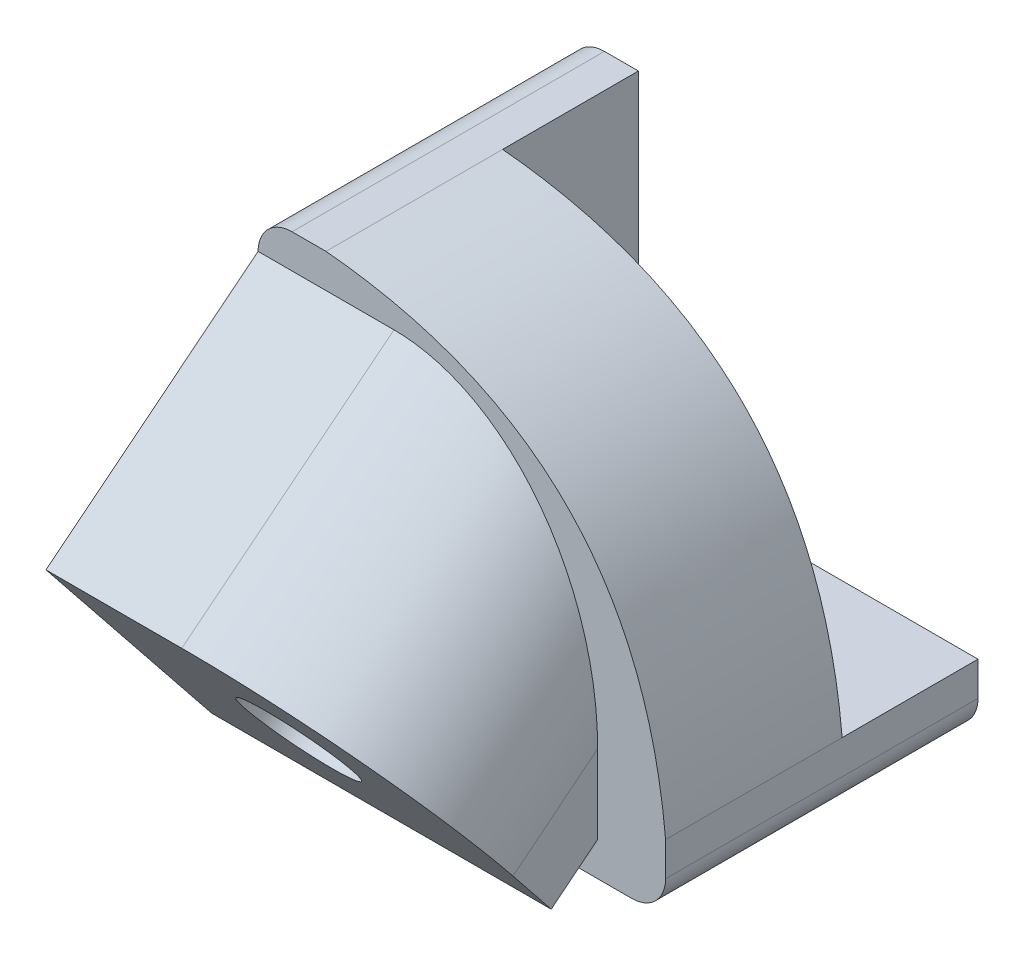
ISO-10303-21;
HEADER;
FILE_DESCRIPTION(('STEP AP214'),'2;1');
FILE_NAME('part.step','',(''),(''),'','','');
FILE_SCHEMA(('AUTOMOTIVE_DESIGN { 1 0 10303 214 1 1 1 1 }'));
ENDSEC;
DATA;
#1=APPLICATION_CONTEXT('core data for automotive mechanical design processes');
#2=APPLICATION_PROTOCOL_DEFINITION('international standard','automotive_design',2000,#1);
#3=PRODUCT_CONTEXT('',#1,'mechanical');
#4=PRODUCT('Part','Part','',(#3));
#5=PRODUCT_RELATED_PRODUCT_CATEGORY('part','',(#4));
#6=PRODUCT_DEFINITION_FORMATION('','',#4);
#7=PRODUCT_DEFINITION_CONTEXT('part definition',#1,'design');
#8=PRODUCT_DEFINITION('design','',#6,#7);
#9=PRODUCT_DEFINITION_SHAPE('','',#8);
#10=(LENGTH_UNIT() NAMED_UNIT(*) SI_UNIT(.MILLI.,.METRE.));
#11=(NAMED_UNIT(*) PLANE_ANGLE_UNIT() SI_UNIT($,.RADIAN.));
#12=(NAMED_UNIT(*) SI_UNIT($,.STERADIAN.) SOLID_ANGLE_UNIT());
#13=UNCERTAINTY_MEASURE_WITH_UNIT(LENGTH_MEASURE(1.E-05),#10,'distance_accuracy_value','');
#14=(GEOMETRIC_REPRESENTATION_CONTEXT(3) GLOBAL_UNCERTAINTY_ASSIGNED_CONTEXT((#13)) GLOBAL_UNIT_ASSIGNED_CONTEXT((#10,
#11,#12)) REPRESENTATION_CONTEXT('',''));
#15=CARTESIAN_POINT('',(0.,0.,0.));
#16=DIRECTION('',(0.,0.,1.));
#17=DIRECTION('',(1.,0.,0.));
#18=AXIS2_PLACEMENT_3D('',#15,#16,#17);
#19=CARTESIAN_POINT('',(8.98515136267031,8.98515136267032,0.));
#20=DIRECTION('',(0.,0.,1.));
#21=DIRECTION('',(1.,0.,0.));
#22=AXIS2_PLACEMENT_3D('',#19,#20,#21);
#23=PLANE('',#22);
#24=DIRECTION('',(0.,-1.,0.));
#25=VECTOR('',#24,1.);
#26=CARTESIAN_POINT('',(0.,0.,0.));
#27=LINE('',#26,#25);
#28=CARTESIAN_POINT('',(0.,12.7,0.));
#29=VERTEX_POINT('',#28);
#30=CARTESIAN_POINT('',(0.,0.,0.));
#31=VERTEX_POINT('',#30);
#32=EDGE_CURVE('E256',#29,#31,#27,.T.);
#33=ORIENTED_EDGE('',*,*,#32,.F.);
#34=CARTESIAN_POINT('',(12.7,0.,0.));
#35=CARTESIAN_POINT('',(11.6203027253406,11.6203027253406,0.));
#36=CARTESIAN_POINT('',(0.,12.7,0.));
#37=B_SPLINE_CURVE_WITH_KNOTS('',2,(#34,#35,#36),.UNSPECIFIED.,.F.,.F.,(3,3),(0.,1.),.UNSPECIFIED.);
#38=CARTESIAN_POINT('',(12.7,0.,0.));
#39=VERTEX_POINT('',#38);
#40=EDGE_CURVE('E372',#39,#29,#37,.T.);
#41=ORIENTED_EDGE('',*,*,#40,.F.);
#42=DIRECTION('',(1.,0.,0.));
#43=VECTOR('',#42,1.);
#44=CARTESIAN_POINT('',(0.,0.,0.));
#45=LINE('',#44,#43);
#46=EDGE_CURVE('E260',#31,#39,#45,.T.);
#47=ORIENTED_EDGE('',*,*,#46,.F.);
#48=EDGE_LOOP('',(#33,#41,#47));
#49=FACE_BOUND('',#48,.T.);
#50=CARTESIAN_POINT('',(5.08,5.08,0.));
#51=DIRECTION('',(0.,0.,1.));
#52=DIRECTION('',(1.,0.,0.));
#53=AXIS2_PLACEMENT_3D('',#50,#51,#52);
#54=CIRCLE('',#53,3.1115);
#55=CARTESIAN_POINT('',(1.9685,5.08,0.));
#56=VERTEX_POINT('',#55);
#57=EDGE_CURVE('E251',#56,#56,#54,.T.);
#58=ORIENTED_EDGE('',*,*,#57,.T.);
#59=EDGE_LOOP('',(#58));
#60=FACE_BOUND('',#59,.T.);
#61=ADVANCED_FACE('F39',(#49,#60),#23,.F.);
#62=CARTESIAN_POINT('',(12.7,0.,3.81));
#63=CARTESIAN_POINT('',(11.6203027253406,11.6203027253406,3.81));
#64=CARTESIAN_POINT('',(0.,12.7,3.81));
#65=B_SPLINE_CURVE_WITH_KNOTS('',2,(#62,#63,#64),.UNSPECIFIED.,.F.,.F.,(3,3),(0.,1.),.UNSPECIFIED.);
#66=DIRECTION('',(0.,0.,-1.));
#67=VECTOR('',#66,1.);
#68=SURFACE_OF_LINEAR_EXTRUSION('',#65,#67);
#69=ORIENTED_EDGE('',*,*,#40,.T.);
#70=DIRECTION('',(0.,0.,-1.));
#71=VECTOR('',#70,1.);
#72=CARTESIAN_POINT('',(0.,12.7,3.81));
#73=LINE('',#72,#71);
#74=CARTESIAN_POINT('',(0.,12.7,6.604));
#75=VERTEX_POINT('',#74);
#76=EDGE_CURVE('E367',#75,#29,#73,.T.);
#77=ORIENTED_EDGE('',*,*,#76,.F.);
#78=CARTESIAN_POINT('',(12.7,0.,6.604));
#79=CARTESIAN_POINT('',(11.6203027253595,11.6203027253595,6.604));
#80=CARTESIAN_POINT('',(0.,12.7,6.604));
#81=B_SPLINE_CURVE_WITH_KNOTS('',2,(#78,#79,#80),.UNSPECIFIED.,.F.,.F.,(3,3),(0.,1.),.UNSPECIFIED.);
#82=CARTESIAN_POINT('',(12.7,0.,6.604));
#83=VERTEX_POINT('',#82);
#84=EDGE_CURVE('E172',#83,#75,#81,.T.);
#85=ORIENTED_EDGE('',*,*,#84,.F.);
#86=DIRECTION('',(0.,0.,-1.));
#87=VECTOR('',#86,1.);
#88=CARTESIAN_POINT('',(12.7,0.,3.81));
#89=LINE('',#88,#87);
#90=EDGE_CURVE('E142',#83,#39,#89,.T.);
#91=ORIENTED_EDGE('',*,*,#90,.T.);
#92=EDGE_LOOP('',(#69,#77,#85,#91));
#93=FACE_BOUND('',#92,.T.);
#94=ADVANCED_FACE('F270',(#93),#68,.F.);
#95=CARTESIAN_POINT('',(5.08,5.08,3.81));
#96=DIRECTION('',(0.,0.,-1.));
#97=DIRECTION('',(-1.,0.,0.));
#98=AXIS2_PLACEMENT_3D('',#95,#96,#97);
#99=CYLINDRICAL_SURFACE('',#98,3.1115);
#100=CARTESIAN_POINT('',(5.08,5.08,3.81));
#101=DIRECTION('',(0.,0.,1.));
#102=DIRECTION('',(1.,0.,0.));
#103=AXIS2_PLACEMENT_3D('',#100,#101,#102);
#104=CIRCLE('',#103,3.1115);
#105=CARTESIAN_POINT('',(1.9685,5.08,3.81));
#106=VERTEX_POINT('',#105);
#107=EDGE_CURVE('E197',#106,#106,#104,.T.);
#108=CARTESIAN_POINT('',(1.9685,5.08,3.81));
#109=CARTESIAN_POINT('',(1.9685,5.08,3.7703125));
#110=CARTESIAN_POINT('',(1.9685,5.08,3.730625));
#111=CARTESIAN_POINT('',(1.9685,5.08,3.65125));
#112=CARTESIAN_POINT('',(1.9685,5.08,3.6115625));
#113=CARTESIAN_POINT('',(1.9685,5.08,3.5321875));
#114=CARTESIAN_POINT('',(1.9685,5.08,3.4925));
#115=CARTESIAN_POINT('',(1.9685,5.08,3.413125));
#116=CARTESIAN_POINT('',(1.9685,5.08,3.3734375));
#117=CARTESIAN_POINT('',(1.9685,5.08,3.2940625));
#118=CARTESIAN_POINT('',(1.9685,5.08,3.254375));
#119=CARTESIAN_POINT('',(1.9685,5.08,3.175));
#120=CARTESIAN_POINT('',(1.9685,5.08,3.1353125));
#121=CARTESIAN_POINT('',(1.9685,5.08,3.0559375));
#122=CARTESIAN_POINT('',(1.9685,5.08,3.01625));
#123=CARTESIAN_POINT('',(1.9685,5.08,2.936875));
#124=CARTESIAN_POINT('',(1.9685,5.08,2.8971875));
#125=CARTESIAN_POINT('',(1.9685,5.08,2.8178125));
#126=CARTESIAN_POINT('',(1.9685,5.08,2.778125));
#127=CARTESIAN_POINT('',(1.9685,5.08,2.69875));
#128=CARTESIAN_POINT('',(1.9685,5.08,2.6590625));
#129=CARTESIAN_POINT('',(1.9685,5.08,2.5796875));
#130=CARTESIAN_POINT('',(1.9685,5.08,2.54));
#131=CARTESIAN_POINT('',(1.9685,5.08,2.460625));
#132=CARTESIAN_POINT('',(1.9685,5.08,2.4209375));
#133=CARTESIAN_POINT('',(1.9685,5.08,2.3415625));
#134=CARTESIAN_POINT('',(1.9685,5.08,2.301875));
#135=CARTESIAN_POINT('',(1.9685,5.08,2.2225));
#136=CARTESIAN_POINT('',(1.9685,5.08,2.1828125));
#137=CARTESIAN_POINT('',(1.9685,5.08,2.1034375));
#138=CARTESIAN_POINT('',(1.9685,5.08,2.06375));
#139=CARTESIAN_POINT('',(1.9685,5.08,1.984375));
#140=CARTESIAN_POINT('',(1.9685,5.08,1.9446875));
#141=CARTESIAN_POINT('',(1.9685,5.08,1.8653125));
#142=CARTESIAN_POINT('',(1.9685,5.08,1.825625));
#143=CARTESIAN_POINT('',(1.9685,5.08,1.74625));
#144=CARTESIAN_POINT('',(1.9685,5.08,1.7065625));
#145=CARTESIAN_POINT('',(1.9685,5.08,1.6271875));
#146=CARTESIAN_POINT('',(1.9685,5.08,1.5875));
#147=CARTESIAN_POINT('',(1.9685,5.08,1.508125));
#148=CARTESIAN_POINT('',(1.9685,5.08,1.4684375));
#149=CARTESIAN_POINT('',(1.9685,5.08,1.3890625));
#150=CARTESIAN_POINT('',(1.9685,5.08,1.349375));
#151=CARTESIAN_POINT('',(1.9685,5.08,1.27));
#152=CARTESIAN_POINT('',(1.9685,5.08,1.2303125));
#153=CARTESIAN_POINT('',(1.9685,5.08,1.1509375));
#154=CARTESIAN_POINT('',(1.9685,5.08,1.11125));
#155=CARTESIAN_POINT('',(1.9685,5.08,1.031875));
#156=CARTESIAN_POINT('',(1.9685,5.08,0.9921875));
#157=CARTESIAN_POINT('',(1.9685,5.08,0.9128125));
#158=CARTESIAN_POINT('',(1.9685,5.08,0.873125));
#159=CARTESIAN_POINT('',(1.9685,5.08,0.79375));
#160=CARTESIAN_POINT('',(1.9685,5.08,0.7540625));
#161=CARTESIAN_POINT('',(1.9685,5.08,0.6746875));
#162=CARTESIAN_POINT('',(1.9685,5.08,0.635));
#163=CARTESIAN_POINT('',(1.9685,5.08,0.555625));
#164=CARTESIAN_POINT('',(1.9685,5.08,0.5159375));
#165=CARTESIAN_POINT('',(1.9685,5.08,0.4365625));
#166=CARTESIAN_POINT('',(1.9685,5.08,0.396875));
#167=CARTESIAN_POINT('',(1.9685,5.08,0.3175));
#168=CARTESIAN_POINT('',(1.9685,5.08,0.2778125));
#169=CARTESIAN_POINT('',(1.9685,5.08,0.1984375));
#170=CARTESIAN_POINT('',(1.9685,5.08,0.15875));
#171=CARTESIAN_POINT('',(1.9685,5.08,0.0793749999999999));
#172=CARTESIAN_POINT('',(1.9685,5.08,0.0396874999999999));
#173=CARTESIAN_POINT('',(1.9685,5.08,0.));
#174=B_SPLINE_CURVE_WITH_KNOTS('',3,(#108,#109,#110,#111,#112,#113,#114,#115,#116,#117,#118,
#119,#120,#121,#122,#123,#124,#125,#126,#127,#128,#129,#130,#131,#132,#133,#134,#135,#136,#137,
#138,#139,#140,#141,#142,#143,#144,#145,#146,#147,#148,#149,#150,#151,#152,#153,#154,#155,#156,
#157,#158,#159,#160,#161,#162,#163,#164,#165,#166,#167,#168,#169,#170,#171,#172,#173),
.UNSPECIFIED.,.F.,.F.,(4,2,2,2,2,2,2,2,2,2,2,2,2,2,2,2,2,2,2,2,2,2,2,2,2,2,2,2,2,2,2,2,4),(0.,
0.1190625,0.238125,0.3571875,0.47625,0.5953125,0.714375,0.8334375,0.9525,1.0715625,1.190625,
1.3096875,1.42875,1.5478125,1.666875,1.7859375,1.905,2.0240625,2.143125,2.2621875,2.38125,
2.5003125,2.619375,2.7384375,2.8575,2.9765625,3.095625,3.2146875,3.33375,3.4528125,3.571875,
3.6909375,3.81),.UNSPECIFIED.);
#175=EDGE_CURVE('BSEAM273',#106,#56,#174,.T.);
#176=ORIENTED_EDGE('',*,*,#107,.T.);
#177=ORIENTED_EDGE('',*,*,#57,.F.);
#178=ORIENTED_EDGE('',*,*,#175,.T.);
#179=ORIENTED_EDGE('',*,*,#175,.F.);
#180=EDGE_LOOP('',(#176,#178,#177,#179));
#181=FACE_BOUND('',#180,.T.);
#182=ADVANCED_FACE('F273',(#181),#99,.F.);
#183=CARTESIAN_POINT('',(0.,0.,3.81));
#184=DIRECTION('',(0.,1.,0.));
#185=DIRECTION('',(0.,0.,1.));
#186=AXIS2_PLACEMENT_3D('',#183,#184,#185);
#187=PLANE('',#186);
#188=ORIENTED_EDGE('',*,*,#46,.T.);
#189=DIRECTION('',(0.,0.,-1.));
#190=VECTOR('',#189,1.);
#191=CARTESIAN_POINT('',(12.7,0.,3.81));
#192=LINE('',#191,#190);
#193=CARTESIAN_POINT('',(12.7,0.,-5.08));
#194=VERTEX_POINT('',#193);
#195=EDGE_CURVE('E237',#39,#194,#192,.T.);
#196=ORIENTED_EDGE('',*,*,#195,.T.);
#197=DIRECTION('',(1.,0.,0.));
#198=VECTOR('',#197,1.);
#199=CARTESIAN_POINT('',(0.,0.,-5.08));
#200=LINE('',#199,#198);
#201=CARTESIAN_POINT('',(0.,0.,-5.08));
#202=VERTEX_POINT('',#201);
#203=EDGE_CURVE('E216',#202,#194,#200,.T.);
#204=ORIENTED_EDGE('',*,*,#203,.F.);
#205=DIRECTION('',(0.,0.,-1.));
#206=VECTOR('',#205,1.);
#207=CARTESIAN_POINT('',(0.,0.,3.81));
#208=LINE('',#207,#206);
#209=EDGE_CURVE('E230',#31,#202,#208,.T.);
#210=ORIENTED_EDGE('',*,*,#209,.F.);
#211=EDGE_LOOP('',(#188,#196,#204,#210));
#212=FACE_BOUND('',#211,.T.);
#213=ADVANCED_FACE('F280',(#212),#187,.T.);
#214=CARTESIAN_POINT('',(0.,12.7,3.81));
#215=DIRECTION('',(1.,0.,0.));
#216=DIRECTION('',(0.,0.,-1.));
#217=AXIS2_PLACEMENT_3D('',#214,#215,#216);
#218=PLANE('',#217);
#219=ORIENTED_EDGE('',*,*,#32,.T.);
#220=ORIENTED_EDGE('',*,*,#209,.T.);
#221=DIRECTION('',(0.,-1.,0.));
#222=VECTOR('',#221,1.);
#223=CARTESIAN_POINT('',(0.,12.7,-5.08));
#224=LINE('',#223,#222);
#225=CARTESIAN_POINT('',(0.,12.7,-5.08));
#226=VERTEX_POINT('',#225);
#227=EDGE_CURVE('E219',#226,#202,#224,.T.);
#228=ORIENTED_EDGE('',*,*,#227,.F.);
#229=DIRECTION('',(0.,0.,-1.));
#230=VECTOR('',#229,1.);
#231=CARTESIAN_POINT('',(0.,12.7,3.81));
#232=LINE('',#231,#230);
#233=EDGE_CURVE('E227',#29,#226,#232,.T.);
#234=ORIENTED_EDGE('',*,*,#233,.F.);
#235=EDGE_LOOP('',(#219,#220,#228,#234));
#236=FACE_BOUND('',#235,.T.);
#237=ADVANCED_FACE('F286',(#236),#218,.T.);
#238=CARTESIAN_POINT('',(-1.27,11.43,3.81));
#239=DIRECTION('',(0.,0.,-1.));
#240=DIRECTION('',(-1.,0.,0.));
#241=AXIS2_PLACEMENT_3D('',#238,#239,#240);
#242=CYLINDRICAL_SURFACE('',#241,1.27);
#243=DIRECTION('',(0.,0.,-1.));
#244=VECTOR('',#243,1.);
#245=CARTESIAN_POINT('',(-1.26999999999999,12.7,3.81));
#246=LINE('',#245,#244);
#247=CARTESIAN_POINT('',(-1.27,12.7,6.604));
#248=VERTEX_POINT('',#247);
#249=CARTESIAN_POINT('',(-1.26999999999999,12.7,-5.08));
#250=VERTEX_POINT('',#249);
#251=EDGE_CURVE('E225',#248,#250,#246,.T.);
#252=ORIENTED_EDGE('',*,*,#251,.T.);
#253=CARTESIAN_POINT('',(-1.27,11.43,-5.08));
#254=DIRECTION('',(0.,0.,1.));
#255=DIRECTION('',(1.,0.,0.));
#256=AXIS2_PLACEMENT_3D('',#253,#254,#255);
#257=CIRCLE('',#256,1.27);
#258=CARTESIAN_POINT('',(-2.54,11.43,-5.08));
#259=VERTEX_POINT('',#258);
#260=EDGE_CURVE('E198',#250,#259,#257,.T.);
#261=ORIENTED_EDGE('',*,*,#260,.T.);
#262=DIRECTION('',(0.,0.,-1.));
#263=VECTOR('',#262,1.);
#264=CARTESIAN_POINT('',(-2.54,11.43,3.81));
#265=LINE('',#264,#263);
#266=CARTESIAN_POINT('',(-2.54,11.43,6.604));
#267=VERTEX_POINT('',#266);
#268=EDGE_CURVE('E235',#267,#259,#265,.T.);
#269=ORIENTED_EDGE('',*,*,#268,.F.);
#270=CARTESIAN_POINT('',(-1.27,11.43,6.604));
#271=DIRECTION('',(0.,0.,1.));
#272=DIRECTION('',(-1.,0.,0.));
#273=AXIS2_PLACEMENT_3D('',#270,#271,#272);
#274=CIRCLE('',#273,1.27);
#275=EDGE_CURVE('E183',#248,#267,#274,.T.);
#276=ORIENTED_EDGE('',*,*,#275,.F.);
#277=EDGE_LOOP('',(#252,#261,#269,#276));
#278=FACE_BOUND('',#277,.T.);
#279=ADVANCED_FACE('F282',(#278),#242,.T.);
#280=CARTESIAN_POINT('',(-2.54,11.43,3.81));
#281=DIRECTION('',(1.,0.,0.));
#282=DIRECTION('',(0.,1.,0.));
#283=AXIS2_PLACEMENT_3D('',#280,#281,#282);
#284=PLANE('',#283);
#285=ORIENTED_EDGE('',*,*,#268,.T.);
#286=DIRECTION('',(0.,-1.,0.));
#287=VECTOR('',#286,1.);
#288=CARTESIAN_POINT('',(-2.54,11.43,-5.08));
#289=LINE('',#288,#287);
#290=CARTESIAN_POINT('',(-2.54,-1.26999999999999,-5.08));
#291=VERTEX_POINT('',#290);
#292=EDGE_CURVE('E201',#259,#291,#289,.T.);
#293=ORIENTED_EDGE('',*,*,#292,.T.);
#294=DIRECTION('',(0.,0.,-1.));
#295=VECTOR('',#294,1.);
#296=CARTESIAN_POINT('',(-2.54,-1.26999999999999,3.81));
#297=LINE('',#296,#295);
#298=CARTESIAN_POINT('',(-2.54,-1.26999999999999,6.604));
#299=VERTEX_POINT('',#298);
#300=EDGE_CURVE('E247',#299,#291,#297,.T.);
#301=ORIENTED_EDGE('',*,*,#300,.F.);
#302=DIRECTION('',(0.,-0.624970196645463,0.780648610646897));
#303=VECTOR('',#302,1.);
#304=CARTESIAN_POINT('',(-2.54,-2.65923281489057,8.33928701469365));
#305=LINE('',#304,#303);
#306=CARTESIAN_POINT('',(-2.54,-2.65923281489057,8.33928701469365));
#307=VERTEX_POINT('',#306);
#308=EDGE_CURVE('E149',#299,#307,#305,.T.);
#309=ORIENTED_EDGE('',*,*,#308,.T.);
#310=DIRECTION('',(0.,0.780648610646902,0.624970196645458));
#311=VECTOR('',#310,1.);
#312=CARTESIAN_POINT('',(-2.54,5.08030280208215,14.5353898841725));
#313=LINE('',#312,#311);
#314=CARTESIAN_POINT('',(-2.54,5.08030280208215,14.5353898841725));
#315=VERTEX_POINT('',#314);
#316=EDGE_CURVE('E160',#307,#315,#313,.T.);
#317=ORIENTED_EDGE('',*,*,#316,.T.);
#318=DIRECTION('',(0.,0.624970196645458,-0.780648610646902));
#319=VECTOR('',#318,1.);
#320=CARTESIAN_POINT('',(-2.54,11.43,6.604));
#321=LINE('',#320,#319);
#322=EDGE_CURVE('E156',#315,#267,#321,.T.);
#323=ORIENTED_EDGE('',*,*,#322,.T.);
#324=EDGE_LOOP('',(#285,#293,#301,#309,#317,#323));
#325=FACE_BOUND('',#324,.T.);
#326=ADVANCED_FACE('F285',(#325),#284,.F.);
#327=CARTESIAN_POINT('',(-1.27,-1.27,3.81));
#328=DIRECTION('',(0.,0.,-1.));
#329=DIRECTION('',(-1.,0.,0.));
#330=AXIS2_PLACEMENT_3D('',#327,#328,#329);
#331=CYLINDRICAL_SURFACE('',#330,1.27);
#332=ORIENTED_EDGE('',*,*,#300,.T.);
#333=CARTESIAN_POINT('',(-1.27,-1.27,-5.08));
#334=DIRECTION('',(0.,0.,-1.));
#335=DIRECTION('',(-1.,0.,0.));
#336=AXIS2_PLACEMENT_3D('',#333,#334,#335);
#337=CIRCLE('',#336,1.27);
#338=CARTESIAN_POINT('',(-1.26999999999999,-2.54,-5.08));
#339=VERTEX_POINT('',#338);
#340=EDGE_CURVE('E204',#339,#291,#337,.T.);
#341=ORIENTED_EDGE('',*,*,#340,.F.);
#342=DIRECTION('',(0.,0.,-1.));
#343=VECTOR('',#342,1.);
#344=CARTESIAN_POINT('',(-1.26999999999999,-2.54,3.81));
#345=LINE('',#344,#343);
#346=CARTESIAN_POINT('',(-1.26999999999999,-2.54,6.604));
#347=VERTEX_POINT('',#346);
#348=EDGE_CURVE('E246',#347,#339,#345,.T.);
#349=ORIENTED_EDGE('',*,*,#348,.F.);
#350=CARTESIAN_POINT('',(-1.27,-1.27,6.604));
#351=DIRECTION('',(0.,0.,1.));
#352=DIRECTION('',(1.,0.,0.));
#353=AXIS2_PLACEMENT_3D('',#350,#351,#352);
#354=CIRCLE('',#353,1.27);
#355=EDGE_CURVE('E186',#299,#347,#354,.T.);
#356=ORIENTED_EDGE('',*,*,#355,.F.);
#357=EDGE_LOOP('',(#332,#341,#349,#356));
#358=FACE_BOUND('',#357,.T.);
#359=ADVANCED_FACE('F290',(#358),#331,.T.);
#360=CARTESIAN_POINT('',(11.43,-2.54,3.81));
#361=DIRECTION('',(0.,-1.,0.));
#362=DIRECTION('',(0.,0.,-1.));
#363=AXIS2_PLACEMENT_3D('',#360,#361,#362);
#364=PLANE('',#363);
#365=ORIENTED_EDGE('',*,*,#348,.T.);
#366=DIRECTION('',(-1.,0.,0.));
#367=VECTOR('',#366,1.);
#368=CARTESIAN_POINT('',(11.43,-2.54,-5.08));
#369=LINE('',#368,#367);
#370=CARTESIAN_POINT('',(11.43,-2.54,-5.08));
#371=VERTEX_POINT('',#370);
#372=EDGE_CURVE('E207',#371,#339,#369,.T.);
#373=ORIENTED_EDGE('',*,*,#372,.F.);
#374=DIRECTION('',(0.,0.,-1.));
#375=VECTOR('',#374,1.);
#376=CARTESIAN_POINT('',(11.43,-2.54,3.81));
#377=LINE('',#376,#375);
#378=CARTESIAN_POINT('',(11.43,-2.54,6.604));
#379=VERTEX_POINT('',#378);
#380=EDGE_CURVE('E244',#379,#371,#377,.T.);
#381=ORIENTED_EDGE('',*,*,#380,.F.);
#382=DIRECTION('',(1.,0.,0.));
#383=VECTOR('',#382,1.);
#384=CARTESIAN_POINT('',(-1.26999999999999,-2.54,6.604));
#385=LINE('',#384,#383);
#386=EDGE_CURVE('E188',#347,#379,#385,.T.);
#387=ORIENTED_EDGE('',*,*,#386,.F.);
#388=EDGE_LOOP('',(#365,#373,#381,#387));
#389=FACE_BOUND('',#388,.T.);
#390=ADVANCED_FACE('F293',(#389),#364,.T.);
#391=CARTESIAN_POINT('',(11.43,-1.27,3.81));
#392=DIRECTION('',(0.,0.,-1.));
#393=DIRECTION('',(-1.,0.,0.));
#394=AXIS2_PLACEMENT_3D('',#391,#392,#393);
#395=CYLINDRICAL_SURFACE('',#394,1.27);
#396=ORIENTED_EDGE('',*,*,#380,.T.);
#397=CARTESIAN_POINT('',(11.43,-1.27,-5.08));
#398=DIRECTION('',(0.,0.,-1.));
#399=DIRECTION('',(-1.,0.,0.));
#400=AXIS2_PLACEMENT_3D('',#397,#398,#399);
#401=CIRCLE('',#400,1.27);
#402=CARTESIAN_POINT('',(12.7,-1.26999999999999,-5.08));
#403=VERTEX_POINT('',#402);
#404=EDGE_CURVE('E210',#403,#371,#401,.T.);
#405=ORIENTED_EDGE('',*,*,#404,.F.);
#406=DIRECTION('',(0.,0.,-1.));
#407=VECTOR('',#406,1.);
#408=CARTESIAN_POINT('',(12.7,-1.26999999999999,3.81));
#409=LINE('',#408,#407);
#410=CARTESIAN_POINT('',(12.7,-1.27,6.604));
#411=VERTEX_POINT('',#410);
#412=EDGE_CURVE('E239',#411,#403,#409,.T.);
#413=ORIENTED_EDGE('',*,*,#412,.F.);
#414=CARTESIAN_POINT('',(11.43,-1.27,6.604));
#415=DIRECTION('',(0.,0.,1.));
#416=DIRECTION('',(1.,0.,0.));
#417=AXIS2_PLACEMENT_3D('',#414,#415,#416);
#418=CIRCLE('',#417,1.27);
#419=EDGE_CURVE('E191',#379,#411,#418,.T.);
#420=ORIENTED_EDGE('',*,*,#419,.F.);
#421=EDGE_LOOP('',(#396,#405,#413,#420));
#422=FACE_BOUND('',#421,.T.);
#423=ADVANCED_FACE('F296',(#422),#395,.T.);
#424=CARTESIAN_POINT('',(12.7,0.,3.81));
#425=DIRECTION('',(1.,0.,0.));
#426=DIRECTION('',(0.,0.,-1.));
#427=AXIS2_PLACEMENT_3D('',#424,#425,#426);
#428=PLANE('',#427);
#429=ORIENTED_EDGE('',*,*,#412,.T.);
#430=DIRECTION('',(0.,-1.,0.));
#431=VECTOR('',#430,1.);
#432=CARTESIAN_POINT('',(12.7,0.,-5.08));
#433=LINE('',#432,#431);
#434=EDGE_CURVE('E213',#194,#403,#433,.T.);
#435=ORIENTED_EDGE('',*,*,#434,.F.);
#436=ORIENTED_EDGE('',*,*,#195,.F.);
#437=ORIENTED_EDGE('',*,*,#90,.F.);
#438=DIRECTION('',(0.,1.,0.));
#439=VECTOR('',#438,1.);
#440=CARTESIAN_POINT('',(12.7,-1.27,6.604));
#441=LINE('',#440,#439);
#442=EDGE_CURVE('E194',#411,#83,#441,.T.);
#443=ORIENTED_EDGE('',*,*,#442,.F.);
#444=EDGE_LOOP('',(#429,#435,#436,#437,#443));
#445=FACE_BOUND('',#444,.T.);
#446=ADVANCED_FACE('F300',(#445),#428,.T.);
#447=CARTESIAN_POINT('',(0.,12.7,3.81));
#448=DIRECTION('',(0.,-1.,0.));
#449=DIRECTION('',(0.,0.,-1.));
#450=AXIS2_PLACEMENT_3D('',#447,#448,#449);
#451=PLANE('',#450);
#452=ORIENTED_EDGE('',*,*,#76,.T.);
#453=ORIENTED_EDGE('',*,*,#233,.T.);
#454=DIRECTION('',(-1.,0.,0.));
#455=VECTOR('',#454,1.);
#456=CARTESIAN_POINT('',(0.,12.7,-5.08));
#457=LINE('',#456,#455);
#458=EDGE_CURVE('E222',#226,#250,#457,.T.);
#459=ORIENTED_EDGE('',*,*,#458,.T.);
#460=ORIENTED_EDGE('',*,*,#251,.F.);
#461=DIRECTION('',(-1.,0.,0.));
#462=VECTOR('',#461,1.);
#463=CARTESIAN_POINT('',(-1.27,12.7,6.604));
#464=LINE('',#463,#462);
#465=EDGE_CURVE('E177',#75,#248,#464,.T.);
#466=ORIENTED_EDGE('',*,*,#465,.F.);
#467=EDGE_LOOP('',(#452,#453,#459,#460,#466));
#468=FACE_BOUND('',#467,.T.);
#469=ADVANCED_FACE('F304',(#468),#451,.F.);
#470=CARTESIAN_POINT('',(-1.27,11.43,-5.08));
#471=DIRECTION('',(0.,0.,1.));
#472=DIRECTION('',(1.,0.,0.));
#473=AXIS2_PLACEMENT_3D('',#470,#471,#472);
#474=PLANE('',#473);
#475=ORIENTED_EDGE('',*,*,#260,.F.);
#476=ORIENTED_EDGE('',*,*,#458,.F.);
#477=ORIENTED_EDGE('',*,*,#227,.T.);
#478=ORIENTED_EDGE('',*,*,#203,.T.);
#479=ORIENTED_EDGE('',*,*,#434,.T.);
#480=ORIENTED_EDGE('',*,*,#404,.T.);
#481=ORIENTED_EDGE('',*,*,#372,.T.);
#482=ORIENTED_EDGE('',*,*,#340,.T.);
#483=ORIENTED_EDGE('',*,*,#292,.F.);
#484=EDGE_LOOP('',(#475,#476,#477,#478,#479,#480,#481,#482,#483));
#485=FACE_BOUND('',#484,.T.);
#486=ADVANCED_FACE('F314',(#485),#474,.F.);
#487=CARTESIAN_POINT('',(8.98515136267974,8.98515136267974,3.81));
#488=DIRECTION('',(0.,0.,1.));
#489=DIRECTION('',(1.,0.,0.));
#490=AXIS2_PLACEMENT_3D('',#487,#488,#489);
#491=PLANE('',#490);
#492=ORIENTED_EDGE('',*,*,#107,.F.);
#493=EDGE_LOOP('',(#492));
#494=FACE_BOUND('',#493,.T.);
#495=ADVANCED_FACE('F318',(#494),#491,.F.);
#496=CARTESIAN_POINT('',(8.98515136267974,8.98515136267974,6.604));
#497=DIRECTION('',(0.,0.,1.));
#498=DIRECTION('',(1.,0.,0.));
#499=AXIS2_PLACEMENT_3D('',#496,#497,#498);
#500=PLANE('',#499);
#501=DIRECTION('',(-1.,0.,0.));
#502=VECTOR('',#501,1.);
#503=CARTESIAN_POINT('',(10.16,11.43,6.604));
#504=LINE('',#503,#502);
#505=CARTESIAN_POINT('',(2.54,11.43,6.604));
#506=VERTEX_POINT('',#505);
#507=EDGE_CURVE('E141',#506,#267,#504,.T.);
#508=ORIENTED_EDGE('',*,*,#507,.F.);
#509=CARTESIAN_POINT('',(2.54,1.66888610563782,6.604));
#510=DIRECTION('',(0.,0.,1.));
#511=DIRECTION('',(0.,1.,0.));
#512=AXIS2_PLACEMENT_3D('',#509,#510,#511);
#513=ELLIPSE('',#512,9.76111389436217,7.62);
#514=CARTESIAN_POINT('',(10.16,1.66888610563782,6.604));
#515=VERTEX_POINT('',#514);
#516=EDGE_CURVE('E11',#506,#515,#513,.F.);
#517=ORIENTED_EDGE('',*,*,#516,.T.);
#518=DIRECTION('',(0.,-1.,0.));
#519=VECTOR('',#518,1.);
#520=CARTESIAN_POINT('',(10.16,-1.26999999999999,6.604));
#521=LINE('',#520,#519);
#522=CARTESIAN_POINT('',(10.16,-1.26999999999999,6.604));
#523=VERTEX_POINT('',#522);
#524=EDGE_CURVE('E132',#515,#523,#521,.T.);
#525=ORIENTED_EDGE('',*,*,#524,.T.);
#526=DIRECTION('',(-1.,0.,0.));
#527=VECTOR('',#526,1.);
#528=CARTESIAN_POINT('',(10.16,-1.26999999999999,6.604));
#529=LINE('',#528,#527);
#530=EDGE_CURVE('E136',#523,#299,#529,.T.);
#531=ORIENTED_EDGE('',*,*,#530,.T.);
#532=ORIENTED_EDGE('',*,*,#355,.T.);
#533=ORIENTED_EDGE('',*,*,#386,.T.);
#534=ORIENTED_EDGE('',*,*,#419,.T.);
#535=ORIENTED_EDGE('',*,*,#442,.T.);
#536=ORIENTED_EDGE('',*,*,#84,.T.);
#537=ORIENTED_EDGE('',*,*,#465,.T.);
#538=ORIENTED_EDGE('',*,*,#275,.T.);
#539=EDGE_LOOP('',(#508,#517,#525,#531,#532,#533,#534,#535,#536,#537,#538));
#540=FACE_BOUND('',#539,.T.);
#541=ADVANCED_FACE('F134',(#540),#500,.T.);
#542=CARTESIAN_POINT('',(10.16,11.43,6.604));
#543=DIRECTION('',(0.,0.780648610646902,0.624970196645458));
#544=DIRECTION('',(0.,-0.624970196645458,0.780648610646902));
#545=AXIS2_PLACEMENT_3D('',#542,#543,#544);
#546=PLANE('',#545);
#547=DIRECTION('',(-1.,0.,0.));
#548=VECTOR('',#547,1.);
#549=CARTESIAN_POINT('',(10.16,5.08030280208214,14.5353898841725));
#550=LINE('',#549,#548);
#551=CARTESIAN_POINT('',(2.54,5.08030280208215,14.5353898841725));
#552=VERTEX_POINT('',#551);
#553=EDGE_CURVE('E170',#552,#315,#550,.T.);
#554=ORIENTED_EDGE('',*,*,#553,.F.);
#555=DIRECTION('',(0.,0.624970196645458,-0.780648610646902));
#556=VECTOR('',#555,1.);
#557=CARTESIAN_POINT('',(2.54,11.43,6.604));
#558=LINE('',#557,#556);
#559=EDGE_CURVE('E169',#552,#506,#558,.T.);
#560=ORIENTED_EDGE('',*,*,#559,.T.);
#561=ORIENTED_EDGE('',*,*,#507,.T.);
#562=ORIENTED_EDGE('',*,*,#322,.F.);
#563=EDGE_LOOP('',(#554,#560,#561,#562));
#564=FACE_BOUND('',#563,.T.);
#565=ADVANCED_FACE('F325',(#564),#546,.T.);
#566=CARTESIAN_POINT('',(10.16,5.08030280208214,14.5353898841725));
#567=DIRECTION('',(0.,-0.624970196645458,0.780648610646902));
#568=DIRECTION('',(0.,-0.780648610646902,-0.624970196645458));
#569=AXIS2_PLACEMENT_3D('',#566,#567,#568);
#570=PLANE('',#569);
#571=CARTESIAN_POINT('',(3.81,1.21053499359579,11.4373384494331));
#572=DIRECTION('',(0.,-0.624970196645458,0.780648610646902));
#573=DIRECTION('',(0.,-0.780648610646902,-0.624970196645458));
#574=AXIS2_PLACEMENT_3D('',#571,#572,#573);
#575=CIRCLE('',#574,2.000000064);
#576=CARTESIAN_POINT('',(3.81,-0.350762277659526,10.1873980161441));
#577=VERTEX_POINT('',#576);
#578=EDGE_CURVE('E348',#577,#577,#575,.T.);
#579=ORIENTED_EDGE('',*,*,#578,.F.);
#580=EDGE_LOOP('',(#579));
#581=FACE_BOUND('',#580,.T.);
#582=DIRECTION('',(0.,0.780648610646902,0.624970196645458));
#583=VECTOR('',#582,1.);
#584=CARTESIAN_POINT('',(10.16,5.08030280208214,14.5353898841725));
#585=LINE('',#584,#583);
#586=CARTESIAN_POINT('',(10.16,-2.65923281489057,8.33928701469365));
#587=VERTEX_POINT('',#586);
#588=CARTESIAN_POINT('',(10.16,-0.868239611047245,9.77311698573413));
#589=VERTEX_POINT('',#588);
#590=EDGE_CURVE('E151',#587,#589,#585,.T.);
#591=ORIENTED_EDGE('',*,*,#590,.T.);
#592=CARTESIAN_POINT('',(2.54,-0.868239611047244,9.77311698573414));
#593=DIRECTION('',(0.,-0.624970196645458,0.780648610646902));
#594=DIRECTION('',(0.,-0.780648610646902,-0.624970196645458));
#595=AXIS2_PLACEMENT_3D('',#592,#593,#594);
#596=CIRCLE('',#595,7.62);
#597=EDGE_CURVE('E48',#589,#552,#596,.T.);
#598=ORIENTED_EDGE('',*,*,#597,.T.);
#599=ORIENTED_EDGE('',*,*,#553,.T.);
#600=ORIENTED_EDGE('',*,*,#316,.F.);
#601=DIRECTION('',(-1.,0.,0.));
#602=VECTOR('',#601,1.);
#603=CARTESIAN_POINT('',(10.16,-2.65923281489057,8.33928701469365));
#604=LINE('',#603,#602);
#605=EDGE_CURVE('E150',#587,#307,#604,.T.);
#606=ORIENTED_EDGE('',*,*,#605,.F.);
#607=EDGE_LOOP('',(#591,#598,#599,#600,#606));
#608=FACE_BOUND('',#607,.T.);
#609=ADVANCED_FACE('F328',(#581,#608),#570,.T.);
#610=CARTESIAN_POINT('',(10.16,-2.65923281489057,8.33928701469365));
#611=DIRECTION('',(0.,-0.780648610646897,-0.624970196645463));
#612=DIRECTION('',(0.,0.624970196645463,-0.780648610646897));
#613=AXIS2_PLACEMENT_3D('',#610,#611,#612);
#614=PLANE('',#613);
#615=ORIENTED_EDGE('',*,*,#308,.F.);
#616=ORIENTED_EDGE('',*,*,#530,.F.);
#617=DIRECTION('',(0.,-0.624970196645463,0.780648610646897));
#618=VECTOR('',#617,1.);
#619=CARTESIAN_POINT('',(10.16,-2.65923281489057,8.33928701469365));
#620=LINE('',#619,#618);
#621=EDGE_CURVE('E147',#523,#587,#620,.T.);
#622=ORIENTED_EDGE('',*,*,#621,.T.);
#623=ORIENTED_EDGE('',*,*,#605,.T.);
#624=EDGE_LOOP('',(#615,#616,#622,#623));
#625=FACE_BOUND('',#624,.T.);
#626=ADVANCED_FACE('F146',(#625),#614,.T.);
#627=CARTESIAN_POINT('',(10.16,0.,0.));
#628=DIRECTION('',(1.,0.,0.));
#629=DIRECTION('',(0.,1.,0.));
#630=AXIS2_PLACEMENT_3D('',#627,#628,#629);
#631=PLANE('',#630);
#632=ORIENTED_EDGE('',*,*,#524,.F.);
#633=DIRECTION('',(0.,0.624970196645458,-0.780648610646902));
#634=VECTOR('',#633,1.);
#635=CARTESIAN_POINT('',(10.16,4.23901313427506,3.39366116326678));
#636=LINE('',#635,#634);
#637=EDGE_CURVE('E359',#515,#589,#636,.F.);
#638=ORIENTED_EDGE('',*,*,#637,.T.);
#639=ORIENTED_EDGE('',*,*,#590,.F.);
#640=ORIENTED_EDGE('',*,*,#621,.F.);
#641=EDGE_LOOP('',(#632,#638,#639,#640));
#642=FACE_BOUND('',#641,.T.);
#643=ADVANCED_FACE('F154',(#642),#631,.T.);
#644=CARTESIAN_POINT('',(2.54,5.48145758687061,1.84172710156161));
#645=DIRECTION('',(0.,0.624970196645458,-0.780648610646902));
#646=DIRECTION('',(0.,0.780648610646902,0.624970196645458));
#647=AXIS2_PLACEMENT_3D('',#644,#645,#646);
#648=CYLINDRICAL_SURFACE('',#647,7.62);
#649=ORIENTED_EDGE('',*,*,#597,.F.);
#650=ORIENTED_EDGE('',*,*,#637,.F.);
#651=ORIENTED_EDGE('',*,*,#516,.F.);
#652=ORIENTED_EDGE('',*,*,#559,.F.);
#653=EDGE_LOOP('',(#649,#650,#651,#652));
#654=FACE_BOUND('',#653,.T.);
#655=ADVANCED_FACE('F41',(#654),#648,.T.);
#656=CARTESIAN_POINT('',(3.81,5.58532635136489,5.97279819832423));
#657=DIRECTION('',(0.,-0.624970196645458,0.780648610646902));
#658=DIRECTION('',(0.,-0.780648610646902,-0.624970196645458));
#659=AXIS2_PLACEMENT_3D('',#656,#657,#658);
#660=CYLINDRICAL_SURFACE('',#659,2.000000064);
#661=CARTESIAN_POINT('',(3.81,5.58532635136489,5.97279819832423));
#662=DIRECTION('',(0.,-0.624970196645458,0.780648610646902));
#663=DIRECTION('',(0.,-0.780648610646902,-0.624970196645458));
#664=AXIS2_PLACEMENT_3D('',#661,#662,#663);
#665=CIRCLE('',#664,2.000000064);
#666=CARTESIAN_POINT('',(3.81,4.02402908010957,4.72285776503522));
#667=VERTEX_POINT('',#666);
#668=EDGE_CURVE('E165',#667,#667,#665,.T.);
#669=ORIENTED_EDGE('',*,*,#668,.F.);
#670=EDGE_LOOP('',(#669));
#671=FACE_BOUND('',#670,.T.);
#672=ORIENTED_EDGE('',*,*,#578,.T.);
#673=EDGE_LOOP('',(#672));
#674=FACE_BOUND('',#673,.T.);
#675=ADVANCED_FACE('F337',(#671,#674),#660,.F.);
#676=CARTESIAN_POINT('',(3.81,5.58532635136489,5.97279819832423));
#677=DIRECTION('',(0.,-0.624970196645458,0.780648610646902));
#678=DIRECTION('',(0.,-0.780648610646902,-0.624970196645458));
#679=AXIS2_PLACEMENT_3D('',#676,#677,#678);
#680=PLANE('',#679);
#681=ORIENTED_EDGE('',*,*,#668,.T.);
#682=EDGE_LOOP('',(#681));
#683=FACE_BOUND('',#682,.T.);
#684=ADVANCED_FACE('F340',(#683),#680,.T.);
#685=CLOSED_SHELL('',(#61,#94,#182,#213,#237,#279,#326,#359,#390,#423,#446,#469,#486,#495,#541,
#565,#609,#626,#643,#655,#675,#684));
#686=MANIFOLD_SOLID_BREP('B2',#685);
#687=ADVANCED_BREP_SHAPE_REPRESENTATION('',(#18,#686),#14);
#688=SHAPE_DEFINITION_REPRESENTATION(#9,#687);
ENDSEC;
END-ISO-10303-21;
